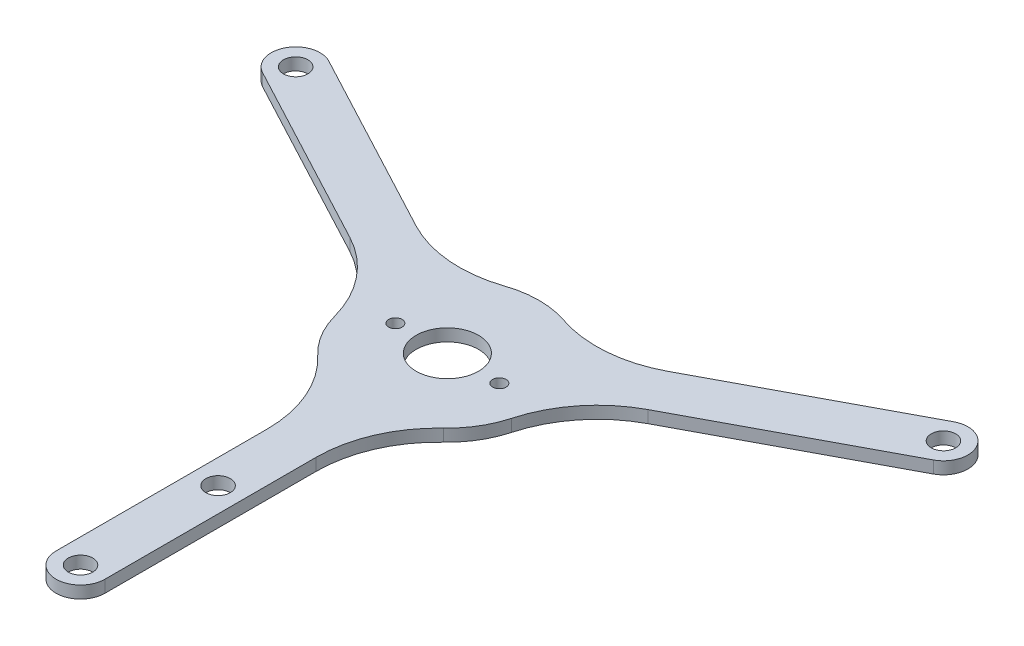
ISO-10303-21;
HEADER;
FILE_DESCRIPTION(('STEP AP214'),'2;1');
FILE_NAME('part.step','',(''),(''),'','','');
FILE_SCHEMA(('AUTOMOTIVE_DESIGN { 1 0 10303 214 1 1 1 1 }'));
ENDSEC;
DATA;
#1=APPLICATION_CONTEXT('core data for automotive mechanical design processes');
#2=APPLICATION_PROTOCOL_DEFINITION('international standard','automotive_design',2000,#1);
#3=PRODUCT_CONTEXT('',#1,'mechanical');
#4=PRODUCT('Part','Part','',(#3));
#5=PRODUCT_RELATED_PRODUCT_CATEGORY('part','',(#4));
#6=PRODUCT_DEFINITION_FORMATION('','',#4);
#7=PRODUCT_DEFINITION_CONTEXT('part definition',#1,'design');
#8=PRODUCT_DEFINITION('design','',#6,#7);
#9=PRODUCT_DEFINITION_SHAPE('','',#8);
#10=(LENGTH_UNIT() NAMED_UNIT(*) SI_UNIT(.MILLI.,.METRE.));
#11=(NAMED_UNIT(*) PLANE_ANGLE_UNIT() SI_UNIT($,.RADIAN.));
#12=(NAMED_UNIT(*) SI_UNIT($,.STERADIAN.) SOLID_ANGLE_UNIT());
#13=UNCERTAINTY_MEASURE_WITH_UNIT(LENGTH_MEASURE(1.E-05),#10,'distance_accuracy_value','');
#14=(GEOMETRIC_REPRESENTATION_CONTEXT(3) GLOBAL_UNCERTAINTY_ASSIGNED_CONTEXT((#13)) GLOBAL_UNIT_ASSIGNED_CONTEXT((#10,
#11,#12)) REPRESENTATION_CONTEXT('',''));
#15=CARTESIAN_POINT('',(0.,0.,0.));
#16=DIRECTION('',(0.,0.,1.));
#17=DIRECTION('',(1.,0.,0.));
#18=AXIS2_PLACEMENT_3D('',#15,#16,#17);
#19=CARTESIAN_POINT('',(-3.99999999999993,2.,0.));
#20=DIRECTION('',(-1.,0.,0.));
#21=DIRECTION('',(0.,0.,1.));
#22=AXIS2_PLACEMENT_3D('',#19,#20,#21);
#23=PLANE('',#22);
#24=DIRECTION('',(0.,0.,-1.));
#25=VECTOR('',#24,1.);
#26=CARTESIAN_POINT('',(-3.99999999999993,2.,0.));
#27=LINE('',#26,#25);
#28=CARTESIAN_POINT('',(-3.99999999999993,2.,60.));
#29=VERTEX_POINT('',#28);
#30=CARTESIAN_POINT('',(-3.99999999999993,2.,25.4754784057141));
#31=VERTEX_POINT('',#30);
#32=EDGE_CURVE('E173',#29,#31,#27,.T.);
#33=ORIENTED_EDGE('',*,*,#32,.T.);
#34=DIRECTION('',(0.,-1.,0.));
#35=VECTOR('',#34,1.);
#36=CARTESIAN_POINT('',(-3.99999999999993,2.,25.4754784057141));
#37=LINE('',#36,#35);
#38=CARTESIAN_POINT('',(-3.99999999999993,0.,25.4754784057141));
#39=VERTEX_POINT('',#38);
#40=EDGE_CURVE('E342',#31,#39,#37,.T.);
#41=ORIENTED_EDGE('',*,*,#40,.T.);
#42=DIRECTION('',(0.,0.,-1.));
#43=VECTOR('',#42,1.);
#44=CARTESIAN_POINT('',(-3.99999999999993,0.,0.));
#45=LINE('',#44,#43);
#46=CARTESIAN_POINT('',(-3.99999999999993,0.,60.));
#47=VERTEX_POINT('',#46);
#48=EDGE_CURVE('E176',#47,#39,#45,.T.);
#49=ORIENTED_EDGE('',*,*,#48,.F.);
#50=DIRECTION('',(0.,-1.,0.));
#51=VECTOR('',#50,1.);
#52=CARTESIAN_POINT('',(-3.99999999999993,2.,60.));
#53=LINE('',#52,#51);
#54=EDGE_CURVE('E169',#29,#47,#53,.T.);
#55=ORIENTED_EDGE('',*,*,#54,.F.);
#56=EDGE_LOOP('',(#33,#41,#49,#55));
#57=FACE_BOUND('',#56,.T.);
#58=ADVANCED_FACE('F43',(#57),#23,.T.);
#59=CARTESIAN_POINT('',(0.,2.,60.));
#60=DIRECTION('',(0.,-1.,0.));
#61=DIRECTION('',(0.,0.,-1.));
#62=AXIS2_PLACEMENT_3D('',#59,#60,#61);
#63=CYLINDRICAL_SURFACE('',#62,4.);
#64=CARTESIAN_POINT('',(0.,0.,60.));
#65=DIRECTION('',(0.,1.,0.));
#66=DIRECTION('',(0.,0.,1.));
#67=AXIS2_PLACEMENT_3D('',#64,#65,#66);
#68=CIRCLE('',#67,4.);
#69=CARTESIAN_POINT('',(4.00000000000003,0.,60.));
#70=VERTEX_POINT('',#69);
#71=EDGE_CURVE('E284',#47,#70,#68,.T.);
#72=ORIENTED_EDGE('',*,*,#71,.T.);
#73=DIRECTION('',(0.,-1.,0.));
#74=VECTOR('',#73,1.);
#75=CARTESIAN_POINT('',(4.00000000000003,2.,60.));
#76=LINE('',#75,#74);
#77=CARTESIAN_POINT('',(4.00000000000003,2.,60.));
#78=VERTEX_POINT('',#77);
#79=EDGE_CURVE('E180',#78,#70,#76,.T.);
#80=ORIENTED_EDGE('',*,*,#79,.F.);
#81=CARTESIAN_POINT('',(0.,2.,60.));
#82=DIRECTION('',(0.,1.,0.));
#83=DIRECTION('',(0.,0.,1.));
#84=AXIS2_PLACEMENT_3D('',#81,#82,#83);
#85=CIRCLE('',#84,4.);
#86=EDGE_CURVE('E183',#29,#78,#85,.T.);
#87=ORIENTED_EDGE('',*,*,#86,.F.);
#88=ORIENTED_EDGE('',*,*,#54,.T.);
#89=EDGE_LOOP('',(#72,#80,#87,#88));
#90=FACE_BOUND('',#89,.T.);
#91=ADVANCED_FACE('F184',(#90),#63,.T.);
#92=CARTESIAN_POINT('',(4.00000000000003,2.,0.));
#93=DIRECTION('',(-1.,0.,0.));
#94=DIRECTION('',(0.,0.,1.));
#95=AXIS2_PLACEMENT_3D('',#92,#93,#94);
#96=PLANE('',#95);
#97=DIRECTION('',(0.,0.,-1.));
#98=VECTOR('',#97,1.);
#99=CARTESIAN_POINT('',(4.00000000000003,0.,0.));
#100=LINE('',#99,#98);
#101=CARTESIAN_POINT('',(4.00000000000003,0.,25.475478405714));
#102=VERTEX_POINT('',#101);
#103=EDGE_CURVE('E286',#70,#102,#100,.T.);
#104=ORIENTED_EDGE('',*,*,#103,.T.);
#105=DIRECTION('',(0.,1.,0.));
#106=VECTOR('',#105,1.);
#107=CARTESIAN_POINT('',(4.00000000000003,2.,25.475478405714));
#108=LINE('',#107,#106);
#109=CARTESIAN_POINT('',(4.00000000000003,2.,25.475478405714));
#110=VERTEX_POINT('',#109);
#111=EDGE_CURVE('E340',#102,#110,#108,.T.);
#112=ORIENTED_EDGE('',*,*,#111,.T.);
#113=DIRECTION('',(0.,0.,-1.));
#114=VECTOR('',#113,1.);
#115=CARTESIAN_POINT('',(4.00000000000003,2.,0.));
#116=LINE('',#115,#114);
#117=EDGE_CURVE('E190',#78,#110,#116,.T.);
#118=ORIENTED_EDGE('',*,*,#117,.F.);
#119=ORIENTED_EDGE('',*,*,#79,.T.);
#120=EDGE_LOOP('',(#104,#112,#118,#119));
#121=FACE_BOUND('',#120,.T.);
#122=ADVANCED_FACE('F420',(#121),#96,.F.);
#123=CARTESIAN_POINT('',(0.,2.,0.));
#124=DIRECTION('',(0.,-1.,0.));
#125=DIRECTION('',(0.,0.,-1.));
#126=AXIS2_PLACEMENT_3D('',#123,#124,#125);
#127=CYLINDRICAL_SURFACE('',#126,15.);
#128=CARTESIAN_POINT('',(0.,2.,0.));
#129=DIRECTION('',(0.,1.,0.));
#130=DIRECTION('',(0.,0.,1.));
#131=AXIS2_PLACEMENT_3D('',#128,#129,#130);
#132=CIRCLE('',#131,15.);
#133=CARTESIAN_POINT('',(10.2857142857143,2.,10.9180621738774));
#134=VERTEX_POINT('',#133);
#135=CARTESIAN_POINT('',(14.4689270751926,2.,3.95602695804228));
#136=VERTEX_POINT('',#135);
#137=EDGE_CURVE('E214',#134,#136,#132,.T.);
#138=ORIENTED_EDGE('',*,*,#137,.F.);
#139=DIRECTION('',(0.,-1.,0.));
#140=VECTOR('',#139,1.);
#141=CARTESIAN_POINT('',(10.2857142857143,2.,10.9180621738774));
#142=LINE('',#141,#140);
#143=CARTESIAN_POINT('',(10.2857142857143,0.,10.9180621738774));
#144=VERTEX_POINT('',#143);
#145=EDGE_CURVE('E337',#134,#144,#142,.T.);
#146=ORIENTED_EDGE('',*,*,#145,.T.);
#147=CARTESIAN_POINT('',(0.,0.,0.));
#148=DIRECTION('',(0.,1.,0.));
#149=DIRECTION('',(0.,0.,1.));
#150=AXIS2_PLACEMENT_3D('',#147,#148,#149);
#151=CIRCLE('',#150,15.);
#152=CARTESIAN_POINT('',(14.4689270751926,0.,3.95602695804228));
#153=VERTEX_POINT('',#152);
#154=EDGE_CURVE('E289',#144,#153,#151,.T.);
#155=ORIENTED_EDGE('',*,*,#154,.T.);
#156=DIRECTION('',(0.,-1.,0.));
#157=VECTOR('',#156,1.);
#158=CARTESIAN_POINT('',(14.4689270751926,2.,3.95602695804228));
#159=LINE('',#158,#157);
#160=EDGE_CURVE('E179',#153,#136,#159,.F.);
#161=ORIENTED_EDGE('',*,*,#160,.T.);
#162=EDGE_LOOP('',(#138,#146,#155,#161));
#163=FACE_BOUND('',#162,.T.);
#164=ADVANCED_FACE('F408',(#163),#127,.T.);
#165=CARTESIAN_POINT('',(1.87788625114359,2.,3.53179037143571));
#166=DIRECTION('',(0.469471562785895,0.,0.882947592858925));
#167=DIRECTION('',(0.882947592858925,0.,-0.469471562785895));
#168=AXIS2_PLACEMENT_3D('',#165,#166,#167);
#169=PLANE('',#168);
#170=DIRECTION('',(-0.882947592858925,0.,0.469471562785895));
#171=VECTOR('',#170,1.);
#172=CARTESIAN_POINT('',(1.87788625114359,2.,3.53179037143571));
#173=LINE('',#172,#171);
#174=CARTESIAN_POINT('',(54.8547418226791,2.,-24.636503395718));
#175=VERTEX_POINT('',#174);
#176=CARTESIAN_POINT('',(24.3713985863983,2.,-8.42822228841316));
#177=VERTEX_POINT('',#176);
#178=EDGE_CURVE('E223',#175,#177,#173,.T.);
#179=ORIENTED_EDGE('',*,*,#178,.T.);
#180=DIRECTION('',(0.,-1.,0.));
#181=VECTOR('',#180,1.);
#182=CARTESIAN_POINT('',(24.3713985863983,2.,-8.42822228841316));
#183=LINE('',#182,#181);
#184=CARTESIAN_POINT('',(24.3713985863983,0.,-8.42822228841316));
#185=VERTEX_POINT('',#184);
#186=EDGE_CURVE('E359',#177,#185,#183,.T.);
#187=ORIENTED_EDGE('',*,*,#186,.T.);
#188=DIRECTION('',(-0.882947592858925,0.,0.469471562785895));
#189=VECTOR('',#188,1.);
#190=CARTESIAN_POINT('',(1.87788625114359,0.,3.53179037143571));
#191=LINE('',#190,#189);
#192=CARTESIAN_POINT('',(54.8547418226791,0.,-24.636503395718));
#193=VERTEX_POINT('',#192);
#194=EDGE_CURVE('E296',#193,#185,#191,.T.);
#195=ORIENTED_EDGE('',*,*,#194,.F.);
#196=DIRECTION('',(0.,-1.,0.));
#197=VECTOR('',#196,1.);
#198=CARTESIAN_POINT('',(54.8547418226791,2.,-24.636503395718));
#199=LINE('',#198,#197);
#200=EDGE_CURVE('E333',#175,#193,#199,.T.);
#201=ORIENTED_EDGE('',*,*,#200,.F.);
#202=EDGE_LOOP('',(#179,#187,#195,#201));
#203=FACE_BOUND('',#202,.T.);
#204=ADVANCED_FACE('F399',(#203),#169,.T.);
#205=CARTESIAN_POINT('',(52.9768555715355,2.,-28.1682937671537));
#206=DIRECTION('',(0.,-1.,0.));
#207=DIRECTION('',(0.,0.,-1.));
#208=AXIS2_PLACEMENT_3D('',#205,#206,#207);
#209=CYLINDRICAL_SURFACE('',#208,4.);
#210=CARTESIAN_POINT('',(52.9768555715355,0.,-28.1682937671537));
#211=DIRECTION('',(0.,1.,0.));
#212=DIRECTION('',(0.,0.,1.));
#213=AXIS2_PLACEMENT_3D('',#210,#211,#212);
#214=CIRCLE('',#213,4.);
#215=CARTESIAN_POINT('',(51.0989693203919,0.,-31.7000841385894));
#216=VERTEX_POINT('',#215);
#217=EDGE_CURVE('E299',#216,#193,#214,.F.);
#218=ORIENTED_EDGE('',*,*,#217,.F.);
#219=DIRECTION('',(0.,-1.,0.));
#220=VECTOR('',#219,1.);
#221=CARTESIAN_POINT('',(51.0989693203919,2.,-31.7000841385894));
#222=LINE('',#221,#220);
#223=CARTESIAN_POINT('',(51.0989693203919,2.,-31.7000841385894));
#224=VERTEX_POINT('',#223);
#225=EDGE_CURVE('E331',#224,#216,#222,.T.);
#226=ORIENTED_EDGE('',*,*,#225,.F.);
#227=CARTESIAN_POINT('',(52.9768555715355,2.,-28.1682937671537));
#228=DIRECTION('',(0.,1.,0.));
#229=DIRECTION('',(0.,0.,1.));
#230=AXIS2_PLACEMENT_3D('',#227,#228,#229);
#231=CIRCLE('',#230,4.);
#232=EDGE_CURVE('E401',#224,#175,#231,.F.);
#233=ORIENTED_EDGE('',*,*,#232,.T.);
#234=ORIENTED_EDGE('',*,*,#200,.T.);
#235=EDGE_LOOP('',(#218,#226,#233,#234));
#236=FACE_BOUND('',#235,.T.);
#237=ADVANCED_FACE('F445',(#236),#209,.T.);
#238=CARTESIAN_POINT('',(-1.87788625114358,2.,-3.53179037143569));
#239=DIRECTION('',(0.469471562785895,0.,0.882947592858924));
#240=DIRECTION('',(0.882947592858925,0.,-0.469471562785896));
#241=AXIS2_PLACEMENT_3D('',#238,#239,#240);
#242=PLANE('',#241);
#243=DIRECTION('',(-0.882947592858925,0.,0.469471562785896));
#244=VECTOR('',#243,1.);
#245=CARTESIAN_POINT('',(-1.87788625114358,0.,-3.53179037143569));
#246=LINE('',#245,#244);
#247=CARTESIAN_POINT('',(20.6156260841111,0.,-15.4918030312846));
#248=VERTEX_POINT('',#247);
#249=EDGE_CURVE('E294',#216,#248,#246,.T.);
#250=ORIENTED_EDGE('',*,*,#249,.T.);
#251=DIRECTION('',(0.,1.,0.));
#252=VECTOR('',#251,1.);
#253=CARTESIAN_POINT('',(20.6156260841111,2.,-15.4918030312846));
#254=LINE('',#253,#252);
#255=CARTESIAN_POINT('',(20.6156260841111,2.,-15.4918030312846));
#256=VERTEX_POINT('',#255);
#257=EDGE_CURVE('E357',#248,#256,#254,.T.);
#258=ORIENTED_EDGE('',*,*,#257,.T.);
#259=DIRECTION('',(-0.882947592858925,0.,0.469471562785896));
#260=VECTOR('',#259,1.);
#261=CARTESIAN_POINT('',(-1.87788625114358,2.,-3.53179037143569));
#262=LINE('',#261,#260);
#263=EDGE_CURVE('E221',#224,#256,#262,.T.);
#264=ORIENTED_EDGE('',*,*,#263,.F.);
#265=ORIENTED_EDGE('',*,*,#225,.T.);
#266=EDGE_LOOP('',(#250,#258,#264,#265));
#267=FACE_BOUND('',#266,.T.);
#268=ADVANCED_FACE('F448',(#267),#242,.F.);
#269=CARTESIAN_POINT('',(4.81122635502566,0.,-14.2074663807699));
#270=VERTEX_POINT('',#269);
#271=CARTESIAN_POINT('',(-4.81122635502567,0.,-14.2074663807699));
#272=VERTEX_POINT('',#271);
#273=EDGE_CURVE('E290',#270,#272,#151,.T.);
#274=ORIENTED_EDGE('',*,*,#273,.T.);
#275=DIRECTION('',(0.,-1.,0.));
#276=VECTOR('',#275,1.);
#277=CARTESIAN_POINT('',(-4.81122635502567,2.,-14.2074663807699));
#278=LINE('',#277,#276);
#279=CARTESIAN_POINT('',(-4.81122635502567,2.,-14.2074663807699));
#280=VERTEX_POINT('',#279);
#281=EDGE_CURVE('E355',#272,#280,#278,.F.);
#282=ORIENTED_EDGE('',*,*,#281,.T.);
#283=CARTESIAN_POINT('',(4.81122635502566,2.,-14.2074663807699));
#284=VERTEX_POINT('',#283);
#285=EDGE_CURVE('E215',#284,#280,#132,.T.);
#286=ORIENTED_EDGE('',*,*,#285,.F.);
#287=DIRECTION('',(0.,-1.,0.));
#288=VECTOR('',#287,1.);
#289=CARTESIAN_POINT('',(4.81122635502566,2.,-14.2074663807699));
#290=LINE('',#289,#288);
#291=EDGE_CURVE('E352',#284,#270,#290,.T.);
#292=ORIENTED_EDGE('',*,*,#291,.T.);
#293=EDGE_LOOP('',(#274,#282,#286,#292));
#294=FACE_BOUND('',#293,.T.);
#295=ADVANCED_FACE('F452',(#294),#127,.T.);
#296=CARTESIAN_POINT('',(1.87788625114358,2.,-3.53179037143569));
#297=DIRECTION('',(0.469471562785895,0.,-0.882947592858925));
#298=DIRECTION('',(-0.882947592858925,0.,-0.469471562785895));
#299=AXIS2_PLACEMENT_3D('',#296,#297,#298);
#300=PLANE('',#299);
#301=DIRECTION('',(0.882947592858925,0.,0.469471562785895));
#302=VECTOR('',#301,1.);
#303=CARTESIAN_POINT('',(1.87788625114358,2.,-3.53179037143569));
#304=LINE('',#303,#302);
#305=CARTESIAN_POINT('',(-51.0989693203919,2.,-31.7000841385894));
#306=VERTEX_POINT('',#305);
#307=CARTESIAN_POINT('',(-20.6156260841111,2.,-15.4918030312846));
#308=VERTEX_POINT('',#307);
#309=EDGE_CURVE('E220',#306,#308,#304,.T.);
#310=ORIENTED_EDGE('',*,*,#309,.T.);
#311=DIRECTION('',(0.,-1.,0.));
#312=VECTOR('',#311,1.);
#313=CARTESIAN_POINT('',(-20.6156260841111,2.,-15.4918030312846));
#314=LINE('',#313,#312);
#315=CARTESIAN_POINT('',(-20.6156260841111,0.,-15.4918030312846));
#316=VERTEX_POINT('',#315);
#317=EDGE_CURVE('E349',#308,#316,#314,.T.);
#318=ORIENTED_EDGE('',*,*,#317,.T.);
#319=DIRECTION('',(0.882947592858925,0.,0.469471562785895));
#320=VECTOR('',#319,1.);
#321=CARTESIAN_POINT('',(1.87788625114358,0.,-3.53179037143569));
#322=LINE('',#321,#320);
#323=CARTESIAN_POINT('',(-51.0989693203919,0.,-31.7000841385894));
#324=VERTEX_POINT('',#323);
#325=EDGE_CURVE('E293',#324,#316,#322,.T.);
#326=ORIENTED_EDGE('',*,*,#325,.F.);
#327=DIRECTION('',(0.,-1.,0.));
#328=VECTOR('',#327,1.);
#329=CARTESIAN_POINT('',(-51.0989693203919,2.,-31.7000841385894));
#330=LINE('',#329,#328);
#331=EDGE_CURVE('E329',#306,#324,#330,.T.);
#332=ORIENTED_EDGE('',*,*,#331,.F.);
#333=EDGE_LOOP('',(#310,#318,#326,#332));
#334=FACE_BOUND('',#333,.T.);
#335=ADVANCED_FACE('F454',(#334),#300,.T.);
#336=CARTESIAN_POINT('',(-52.9768555715355,2.,-28.1682937671537));
#337=DIRECTION('',(0.,-1.,0.));
#338=DIRECTION('',(0.,0.,-1.));
#339=AXIS2_PLACEMENT_3D('',#336,#337,#338);
#340=CYLINDRICAL_SURFACE('',#339,4.);
#341=CARTESIAN_POINT('',(-52.9768555715355,0.,-28.1682937671537));
#342=DIRECTION('',(0.,1.,0.));
#343=DIRECTION('',(0.,0.,1.));
#344=AXIS2_PLACEMENT_3D('',#341,#342,#343);
#345=CIRCLE('',#344,4.);
#346=CARTESIAN_POINT('',(-54.8547418226791,0.,-24.636503395718));
#347=VERTEX_POINT('',#346);
#348=EDGE_CURVE('E306',#324,#347,#345,.T.);
#349=ORIENTED_EDGE('',*,*,#348,.T.);
#350=DIRECTION('',(0.,-1.,0.));
#351=VECTOR('',#350,1.);
#352=CARTESIAN_POINT('',(-54.8547418226791,2.,-24.636503395718));
#353=LINE('',#352,#351);
#354=CARTESIAN_POINT('',(-54.8547418226791,2.,-24.636503395718));
#355=VERTEX_POINT('',#354);
#356=EDGE_CURVE('E282',#355,#347,#353,.T.);
#357=ORIENTED_EDGE('',*,*,#356,.F.);
#358=CARTESIAN_POINT('',(-52.9768555715355,2.,-28.1682937671537));
#359=DIRECTION('',(0.,1.,0.));
#360=DIRECTION('',(0.,0.,1.));
#361=AXIS2_PLACEMENT_3D('',#358,#359,#360);
#362=CIRCLE('',#361,4.);
#363=EDGE_CURVE('E240',#306,#355,#362,.T.);
#364=ORIENTED_EDGE('',*,*,#363,.F.);
#365=ORIENTED_EDGE('',*,*,#331,.T.);
#366=EDGE_LOOP('',(#349,#357,#364,#365));
#367=FACE_BOUND('',#366,.T.);
#368=ADVANCED_FACE('F457',(#367),#340,.T.);
#369=CARTESIAN_POINT('',(-1.87788625114359,2.,3.53179037143571));
#370=DIRECTION('',(0.469471562785895,0.,-0.882947592858925));
#371=DIRECTION('',(-0.882947592858925,0.,-0.469471562785895));
#372=AXIS2_PLACEMENT_3D('',#369,#370,#371);
#373=PLANE('',#372);
#374=DIRECTION('',(0.882947592858925,0.,0.469471562785895));
#375=VECTOR('',#374,1.);
#376=CARTESIAN_POINT('',(-1.87788625114359,0.,3.53179037143571));
#377=LINE('',#376,#375);
#378=CARTESIAN_POINT('',(-24.3713985863983,0.,-8.42822228841316));
#379=VERTEX_POINT('',#378);
#380=EDGE_CURVE('E308',#347,#379,#377,.T.);
#381=ORIENTED_EDGE('',*,*,#380,.T.);
#382=DIRECTION('',(0.,1.,0.));
#383=VECTOR('',#382,1.);
#384=CARTESIAN_POINT('',(-24.3713985863983,2.,-8.42822228841316));
#385=LINE('',#384,#383);
#386=CARTESIAN_POINT('',(-24.3713985863983,2.,-8.42822228841316));
#387=VERTEX_POINT('',#386);
#388=EDGE_CURVE('E59',#379,#387,#385,.T.);
#389=ORIENTED_EDGE('',*,*,#388,.T.);
#390=DIRECTION('',(0.882947592858925,0.,0.469471562785895));
#391=VECTOR('',#390,1.);
#392=CARTESIAN_POINT('',(-1.87788625114359,2.,3.53179037143571));
#393=LINE('',#392,#391);
#394=EDGE_CURVE('E245',#355,#387,#393,.T.);
#395=ORIENTED_EDGE('',*,*,#394,.F.);
#396=ORIENTED_EDGE('',*,*,#356,.T.);
#397=EDGE_LOOP('',(#381,#389,#395,#396));
#398=FACE_BOUND('',#397,.T.);
#399=ADVANCED_FACE('F461',(#398),#373,.F.);
#400=CARTESIAN_POINT('',(-52.9768555715355,2.,-28.1682937671537));
#401=DIRECTION('',(0.,-1.,0.));
#402=DIRECTION('',(0.,0.,-1.));
#403=AXIS2_PLACEMENT_3D('',#400,#401,#402);
#404=CYLINDRICAL_SURFACE('',#403,2.00000000000323);
#405=CARTESIAN_POINT('',(-52.9768555715355,2.,-28.1682937671537));
#406=DIRECTION('',(0.,1.,0.));
#407=DIRECTION('',(0.,0.,1.));
#408=AXIS2_PLACEMENT_3D('',#405,#406,#407);
#409=CIRCLE('',#408,2.00000000000323);
#410=CARTESIAN_POINT('',(-52.9768555715355,2.,-26.1682937671505));
#411=VERTEX_POINT('',#410);
#412=EDGE_CURVE('E273',#411,#411,#409,.T.);
#413=ORIENTED_EDGE('',*,*,#412,.T.);
#414=EDGE_LOOP('',(#413));
#415=FACE_BOUND('',#414,.T.);
#416=CARTESIAN_POINT('',(-52.9768555715355,0.,-28.1682937671537));
#417=DIRECTION('',(0.,1.,0.));
#418=DIRECTION('',(0.,0.,1.));
#419=AXIS2_PLACEMENT_3D('',#416,#417,#418);
#420=CIRCLE('',#419,2.00000000000323);
#421=CARTESIAN_POINT('',(-52.9768555715355,0.,-26.1682937671505));
#422=VERTEX_POINT('',#421);
#423=EDGE_CURVE('E201',#422,#422,#420,.T.);
#424=ORIENTED_EDGE('',*,*,#423,.F.);
#425=EDGE_LOOP('',(#424));
#426=FACE_BOUND('',#425,.T.);
#427=ADVANCED_FACE('F465',(#415,#426),#404,.F.);
#428=CARTESIAN_POINT('',(-8.5,2.,0.));
#429=DIRECTION('',(0.,-1.,0.));
#430=DIRECTION('',(0.,0.,-1.));
#431=AXIS2_PLACEMENT_3D('',#428,#429,#430);
#432=CYLINDRICAL_SURFACE('',#431,1.1);
#433=CARTESIAN_POINT('',(-8.5,2.,0.));
#434=DIRECTION('',(0.,1.,0.));
#435=DIRECTION('',(0.,0.,1.));
#436=AXIS2_PLACEMENT_3D('',#433,#434,#435);
#437=CIRCLE('',#436,1.1);
#438=CARTESIAN_POINT('',(-8.5,2.,1.1));
#439=VERTEX_POINT('',#438);
#440=EDGE_CURVE('E270',#439,#439,#437,.F.);
#441=ORIENTED_EDGE('',*,*,#440,.F.);
#442=EDGE_LOOP('',(#441));
#443=FACE_BOUND('',#442,.T.);
#444=CARTESIAN_POINT('',(-8.5,0.,0.));
#445=DIRECTION('',(0.,1.,0.));
#446=DIRECTION('',(0.,0.,1.));
#447=AXIS2_PLACEMENT_3D('',#444,#445,#446);
#448=CIRCLE('',#447,1.1);
#449=CARTESIAN_POINT('',(-8.5,0.,1.1));
#450=VERTEX_POINT('',#449);
#451=EDGE_CURVE('E322',#450,#450,#448,.F.);
#452=ORIENTED_EDGE('',*,*,#451,.T.);
#453=EDGE_LOOP('',(#452));
#454=FACE_BOUND('',#453,.T.);
#455=ADVANCED_FACE('F484',(#443,#454),#432,.F.);
#456=CARTESIAN_POINT('',(8.5,2.,0.));
#457=DIRECTION('',(0.,-1.,0.));
#458=DIRECTION('',(0.,0.,-1.));
#459=AXIS2_PLACEMENT_3D('',#456,#457,#458);
#460=CYLINDRICAL_SURFACE('',#459,1.1);
#461=CARTESIAN_POINT('',(8.5,2.,0.));
#462=DIRECTION('',(0.,1.,0.));
#463=DIRECTION('',(0.,0.,1.));
#464=AXIS2_PLACEMENT_3D('',#461,#462,#463);
#465=CIRCLE('',#464,1.1);
#466=CARTESIAN_POINT('',(8.5,2.,1.1));
#467=VERTEX_POINT('',#466);
#468=EDGE_CURVE('E265',#467,#467,#465,.T.);
#469=ORIENTED_EDGE('',*,*,#468,.T.);
#470=EDGE_LOOP('',(#469));
#471=FACE_BOUND('',#470,.T.);
#472=CARTESIAN_POINT('',(8.5,0.,0.));
#473=DIRECTION('',(0.,1.,0.));
#474=DIRECTION('',(0.,0.,1.));
#475=AXIS2_PLACEMENT_3D('',#472,#473,#474);
#476=CIRCLE('',#475,1.1);
#477=CARTESIAN_POINT('',(8.5,0.,1.1));
#478=VERTEX_POINT('',#477);
#479=EDGE_CURVE('E319',#478,#478,#476,.T.);
#480=ORIENTED_EDGE('',*,*,#479,.F.);
#481=EDGE_LOOP('',(#480));
#482=FACE_BOUND('',#481,.T.);
#483=ADVANCED_FACE('F480',(#471,#482),#460,.F.);
#484=CARTESIAN_POINT('',(0.,2.,60.));
#485=DIRECTION('',(0.,-1.,0.));
#486=DIRECTION('',(0.,0.,-1.));
#487=AXIS2_PLACEMENT_3D('',#484,#485,#486);
#488=CYLINDRICAL_SURFACE('',#487,2.00000000000324);
#489=CARTESIAN_POINT('',(0.,2.,60.));
#490=DIRECTION('',(0.,1.,0.));
#491=DIRECTION('',(0.,0.,1.));
#492=AXIS2_PLACEMENT_3D('',#489,#490,#491);
#493=CIRCLE('',#492,2.00000000000324);
#494=CARTESIAN_POINT('',(0.,2.,62.0000000000032));
#495=VERTEX_POINT('',#494);
#496=EDGE_CURVE('E260',#495,#495,#493,.T.);
#497=ORIENTED_EDGE('',*,*,#496,.T.);
#498=EDGE_LOOP('',(#497));
#499=FACE_BOUND('',#498,.T.);
#500=CARTESIAN_POINT('',(0.,0.,60.));
#501=DIRECTION('',(0.,1.,0.));
#502=DIRECTION('',(0.,0.,1.));
#503=AXIS2_PLACEMENT_3D('',#500,#501,#502);
#504=CIRCLE('',#503,2.00000000000324);
#505=CARTESIAN_POINT('',(0.,0.,62.0000000000032));
#506=VERTEX_POINT('',#505);
#507=EDGE_CURVE('E316',#506,#506,#504,.T.);
#508=ORIENTED_EDGE('',*,*,#507,.F.);
#509=EDGE_LOOP('',(#508));
#510=FACE_BOUND('',#509,.T.);
#511=ADVANCED_FACE('F476',(#499,#510),#488,.F.);
#512=CARTESIAN_POINT('',(0.,2.,0.));
#513=DIRECTION('',(0.,-1.,0.));
#514=DIRECTION('',(0.,0.,-1.));
#515=AXIS2_PLACEMENT_3D('',#512,#513,#514);
#516=CYLINDRICAL_SURFACE('',#515,5.1);
#517=CARTESIAN_POINT('',(0.,2.,0.));
#518=DIRECTION('',(0.,1.,0.));
#519=DIRECTION('',(0.,0.,1.));
#520=AXIS2_PLACEMENT_3D('',#517,#518,#519);
#521=CIRCLE('',#520,5.1);
#522=CARTESIAN_POINT('',(0.,2.,5.1));
#523=VERTEX_POINT('',#522);
#524=EDGE_CURVE('E256',#523,#523,#521,.T.);
#525=ORIENTED_EDGE('',*,*,#524,.T.);
#526=EDGE_LOOP('',(#525));
#527=FACE_BOUND('',#526,.T.);
#528=CARTESIAN_POINT('',(0.,0.,0.));
#529=DIRECTION('',(0.,1.,0.));
#530=DIRECTION('',(0.,0.,1.));
#531=AXIS2_PLACEMENT_3D('',#528,#529,#530);
#532=CIRCLE('',#531,5.1);
#533=CARTESIAN_POINT('',(0.,0.,5.1));
#534=VERTEX_POINT('',#533);
#535=EDGE_CURVE('E313',#534,#534,#532,.T.);
#536=ORIENTED_EDGE('',*,*,#535,.F.);
#537=EDGE_LOOP('',(#536));
#538=FACE_BOUND('',#537,.T.);
#539=ADVANCED_FACE('F472',(#527,#538),#516,.F.);
#540=CARTESIAN_POINT('',(0.,2.,37.5));
#541=DIRECTION('',(0.,-1.,0.));
#542=DIRECTION('',(0.,0.,-1.));
#543=AXIS2_PLACEMENT_3D('',#540,#541,#542);
#544=CYLINDRICAL_SURFACE('',#543,2.);
#545=CARTESIAN_POINT('',(0.,2.,37.5));
#546=DIRECTION('',(0.,1.,0.));
#547=DIRECTION('',(0.,0.,1.));
#548=AXIS2_PLACEMENT_3D('',#545,#546,#547);
#549=CIRCLE('',#548,2.);
#550=CARTESIAN_POINT('',(0.,2.,39.5));
#551=VERTEX_POINT('',#550);
#552=EDGE_CURVE('E249',#551,#551,#549,.T.);
#553=ORIENTED_EDGE('',*,*,#552,.T.);
#554=EDGE_LOOP('',(#553));
#555=FACE_BOUND('',#554,.T.);
#556=CARTESIAN_POINT('',(0.,0.,37.5));
#557=DIRECTION('',(0.,1.,0.));
#558=DIRECTION('',(0.,0.,1.));
#559=AXIS2_PLACEMENT_3D('',#556,#557,#558);
#560=CIRCLE('',#559,2.);
#561=CARTESIAN_POINT('',(0.,0.,39.5));
#562=VERTEX_POINT('',#561);
#563=EDGE_CURVE('E310',#562,#562,#560,.T.);
#564=ORIENTED_EDGE('',*,*,#563,.F.);
#565=EDGE_LOOP('',(#564));
#566=FACE_BOUND('',#565,.T.);
#567=ADVANCED_FACE('F469',(#555,#566),#544,.F.);
#568=CARTESIAN_POINT('',(-14.4689270751926,0.,3.95602695804229));
#569=VERTEX_POINT('',#568);
#570=CARTESIAN_POINT('',(-10.2857142857143,0.,10.9180621738775));
#571=VERTEX_POINT('',#570);
#572=EDGE_CURVE('E295',#569,#571,#151,.T.);
#573=ORIENTED_EDGE('',*,*,#572,.T.);
#574=DIRECTION('',(0.,-1.,0.));
#575=VECTOR('',#574,1.);
#576=CARTESIAN_POINT('',(-10.2857142857143,2.,10.9180621738775));
#577=LINE('',#576,#575);
#578=CARTESIAN_POINT('',(-10.2857142857143,2.,10.9180621738775));
#579=VERTEX_POINT('',#578);
#580=EDGE_CURVE('E347',#571,#579,#577,.F.);
#581=ORIENTED_EDGE('',*,*,#580,.T.);
#582=CARTESIAN_POINT('',(-14.4689270751926,2.,3.95602695804229));
#583=VERTEX_POINT('',#582);
#584=EDGE_CURVE('E222',#583,#579,#132,.T.);
#585=ORIENTED_EDGE('',*,*,#584,.F.);
#586=DIRECTION('',(0.,-1.,0.));
#587=VECTOR('',#586,1.);
#588=CARTESIAN_POINT('',(-14.4689270751926,2.,3.95602695804229));
#589=LINE('',#588,#587);
#590=EDGE_CURVE('E344',#583,#569,#589,.T.);
#591=ORIENTED_EDGE('',*,*,#590,.T.);
#592=EDGE_LOOP('',(#573,#581,#585,#591));
#593=FACE_BOUND('',#592,.T.);
#594=ADVANCED_FACE('F413',(#593),#127,.T.);
#595=CARTESIAN_POINT('',(52.9768555715355,2.,-28.1682937671537));
#596=DIRECTION('',(0.,-1.,0.));
#597=DIRECTION('',(0.,0.,-1.));
#598=AXIS2_PLACEMENT_3D('',#595,#596,#597);
#599=CYLINDRICAL_SURFACE('',#598,2.00000000000322);
#600=CARTESIAN_POINT('',(52.9768555715355,2.,-28.1682937671537));
#601=DIRECTION('',(0.,1.,0.));
#602=DIRECTION('',(0.,0.,1.));
#603=AXIS2_PLACEMENT_3D('',#600,#601,#602);
#604=CIRCLE('',#603,2.00000000000322);
#605=CARTESIAN_POINT('',(52.9768555715355,2.,-26.1682937671505));
#606=VERTEX_POINT('',#605);
#607=EDGE_CURVE('E278',#606,#606,#604,.F.);
#608=ORIENTED_EDGE('',*,*,#607,.F.);
#609=EDGE_LOOP('',(#608));
#610=FACE_BOUND('',#609,.T.);
#611=CARTESIAN_POINT('',(52.9768555715355,0.,-28.1682937671537));
#612=DIRECTION('',(0.,1.,0.));
#613=DIRECTION('',(0.,0.,1.));
#614=AXIS2_PLACEMENT_3D('',#611,#612,#613);
#615=CIRCLE('',#614,2.00000000000322);
#616=CARTESIAN_POINT('',(52.9768555715355,0.,-26.1682937671505));
#617=VERTEX_POINT('',#616);
#618=EDGE_CURVE('E198',#617,#617,#615,.F.);
#619=ORIENTED_EDGE('',*,*,#618,.T.);
#620=EDGE_LOOP('',(#619));
#621=FACE_BOUND('',#620,.T.);
#622=ADVANCED_FACE('F468',(#610,#621),#599,.F.);
#623=CARTESIAN_POINT('',(0.,2.,0.));
#624=DIRECTION('',(0.,1.,0.));
#625=DIRECTION('',(0.,0.,1.));
#626=AXIS2_PLACEMENT_3D('',#623,#624,#625);
#627=PLANE('',#626);
#628=ORIENTED_EDGE('',*,*,#32,.F.);
#629=ORIENTED_EDGE('',*,*,#86,.T.);
#630=ORIENTED_EDGE('',*,*,#117,.T.);
#631=CARTESIAN_POINT('',(24.,2.,25.475478405714));
#632=DIRECTION('',(0.,1.,0.));
#633=DIRECTION('',(0.,0.,1.));
#634=AXIS2_PLACEMENT_3D('',#631,#632,#633);
#635=CIRCLE('',#634,20.);
#636=EDGE_CURVE('E365',#110,#134,#635,.F.);
#637=ORIENTED_EDGE('',*,*,#636,.T.);
#638=ORIENTED_EDGE('',*,*,#137,.T.);
#639=CARTESIAN_POINT('',(33.7608298421162,2.,9.23072956876533));
#640=DIRECTION('',(0.,1.,0.));
#641=DIRECTION('',(0.,0.,1.));
#642=AXIS2_PLACEMENT_3D('',#639,#640,#641);
#643=CIRCLE('',#642,20.);
#644=EDGE_CURVE('E384',#136,#177,#643,.F.);
#645=ORIENTED_EDGE('',*,*,#644,.T.);
#646=ORIENTED_EDGE('',*,*,#178,.F.);
#647=ORIENTED_EDGE('',*,*,#232,.F.);
#648=ORIENTED_EDGE('',*,*,#263,.T.);
#649=CARTESIAN_POINT('',(11.2261948283932,2.,-33.1507548884631));
#650=DIRECTION('',(0.,1.,0.));
#651=DIRECTION('',(0.,0.,1.));
#652=AXIS2_PLACEMENT_3D('',#649,#650,#651);
#653=CIRCLE('',#652,20.);
#654=EDGE_CURVE('E379',#256,#284,#653,.F.);
#655=ORIENTED_EDGE('',*,*,#654,.T.);
#656=ORIENTED_EDGE('',*,*,#285,.T.);
#657=CARTESIAN_POINT('',(-11.2261948283932,2.,-33.1507548884631));
#658=DIRECTION('',(0.,1.,0.));
#659=DIRECTION('',(0.,0.,1.));
#660=AXIS2_PLACEMENT_3D('',#657,#658,#659);
#661=CIRCLE('',#660,20.);
#662=EDGE_CURVE('E374',#280,#308,#661,.F.);
#663=ORIENTED_EDGE('',*,*,#662,.T.);
#664=ORIENTED_EDGE('',*,*,#309,.F.);
#665=ORIENTED_EDGE('',*,*,#363,.T.);
#666=ORIENTED_EDGE('',*,*,#394,.T.);
#667=CARTESIAN_POINT('',(-33.7608298421162,2.,9.23072956876535));
#668=DIRECTION('',(0.,1.,0.));
#669=DIRECTION('',(0.,0.,1.));
#670=AXIS2_PLACEMENT_3D('',#667,#668,#669);
#671=CIRCLE('',#670,20.);
#672=EDGE_CURVE('E12',#387,#583,#671,.F.);
#673=ORIENTED_EDGE('',*,*,#672,.T.);
#674=ORIENTED_EDGE('',*,*,#584,.T.);
#675=CARTESIAN_POINT('',(-23.9999999999999,2.,25.4754784057141));
#676=DIRECTION('',(0.,1.,0.));
#677=DIRECTION('',(0.,0.,1.));
#678=AXIS2_PLACEMENT_3D('',#675,#676,#677);
#679=CIRCLE('',#678,20.);
#680=EDGE_CURVE('E196',#579,#31,#679,.F.);
#681=ORIENTED_EDGE('',*,*,#680,.T.);
#682=EDGE_LOOP('',(#628,#629,#630,#637,#638,#645,#646,#647,#648,#655,#656,#663,#664,#665,#666,
#673,#674,#681));
#683=FACE_BOUND('',#682,.T.);
#684=ORIENTED_EDGE('',*,*,#552,.F.);
#685=EDGE_LOOP('',(#684));
#686=FACE_BOUND('',#685,.T.);
#687=ORIENTED_EDGE('',*,*,#524,.F.);
#688=EDGE_LOOP('',(#687));
#689=FACE_BOUND('',#688,.T.);
#690=ORIENTED_EDGE('',*,*,#496,.F.);
#691=EDGE_LOOP('',(#690));
#692=FACE_BOUND('',#691,.T.);
#693=ORIENTED_EDGE('',*,*,#468,.F.);
#694=EDGE_LOOP('',(#693));
#695=FACE_BOUND('',#694,.T.);
#696=ORIENTED_EDGE('',*,*,#440,.T.);
#697=EDGE_LOOP('',(#696));
#698=FACE_BOUND('',#697,.T.);
#699=ORIENTED_EDGE('',*,*,#412,.F.);
#700=EDGE_LOOP('',(#699));
#701=FACE_BOUND('',#700,.T.);
#702=ORIENTED_EDGE('',*,*,#607,.T.);
#703=EDGE_LOOP('',(#702));
#704=FACE_BOUND('',#703,.T.);
#705=ADVANCED_FACE('F192',(#683,#686,#689,#692,#695,#698,#701,#704),#627,.T.);
#706=CARTESIAN_POINT('',(0.,0.,0.));
#707=DIRECTION('',(0.,1.,0.));
#708=DIRECTION('',(0.,0.,1.));
#709=AXIS2_PLACEMENT_3D('',#706,#707,#708);
#710=PLANE('',#709);
#711=ORIENTED_EDGE('',*,*,#48,.T.);
#712=CARTESIAN_POINT('',(-23.9999999999999,0.,25.4754784057141));
#713=DIRECTION('',(0.,1.,0.));
#714=DIRECTION('',(0.,0.,1.));
#715=AXIS2_PLACEMENT_3D('',#712,#713,#714);
#716=CIRCLE('',#715,20.);
#717=EDGE_CURVE('E368',#39,#571,#716,.T.);
#718=ORIENTED_EDGE('',*,*,#717,.T.);
#719=ORIENTED_EDGE('',*,*,#572,.F.);
#720=CARTESIAN_POINT('',(-33.7608298421162,0.,9.23072956876535));
#721=DIRECTION('',(0.,1.,0.));
#722=DIRECTION('',(0.,0.,1.));
#723=AXIS2_PLACEMENT_3D('',#720,#721,#722);
#724=CIRCLE('',#723,20.);
#725=EDGE_CURVE('E52',#569,#379,#724,.T.);
#726=ORIENTED_EDGE('',*,*,#725,.T.);
#727=ORIENTED_EDGE('',*,*,#380,.F.);
#728=ORIENTED_EDGE('',*,*,#348,.F.);
#729=ORIENTED_EDGE('',*,*,#325,.T.);
#730=CARTESIAN_POINT('',(-11.2261948283932,0.,-33.1507548884631));
#731=DIRECTION('',(0.,1.,0.));
#732=DIRECTION('',(0.,0.,1.));
#733=AXIS2_PLACEMENT_3D('',#730,#731,#732);
#734=CIRCLE('',#733,20.);
#735=EDGE_CURVE('E372',#316,#272,#734,.T.);
#736=ORIENTED_EDGE('',*,*,#735,.T.);
#737=ORIENTED_EDGE('',*,*,#273,.F.);
#738=CARTESIAN_POINT('',(11.2261948283932,0.,-33.1507548884631));
#739=DIRECTION('',(0.,1.,0.));
#740=DIRECTION('',(0.,0.,1.));
#741=AXIS2_PLACEMENT_3D('',#738,#739,#740);
#742=CIRCLE('',#741,20.);
#743=EDGE_CURVE('E377',#270,#248,#742,.T.);
#744=ORIENTED_EDGE('',*,*,#743,.T.);
#745=ORIENTED_EDGE('',*,*,#249,.F.);
#746=ORIENTED_EDGE('',*,*,#217,.T.);
#747=ORIENTED_EDGE('',*,*,#194,.T.);
#748=CARTESIAN_POINT('',(33.7608298421162,0.,9.23072956876533));
#749=DIRECTION('',(0.,1.,0.));
#750=DIRECTION('',(0.,0.,1.));
#751=AXIS2_PLACEMENT_3D('',#748,#749,#750);
#752=CIRCLE('',#751,20.);
#753=EDGE_CURVE('E382',#185,#153,#752,.T.);
#754=ORIENTED_EDGE('',*,*,#753,.T.);
#755=ORIENTED_EDGE('',*,*,#154,.F.);
#756=CARTESIAN_POINT('',(24.,0.,25.475478405714));
#757=DIRECTION('',(0.,1.,0.));
#758=DIRECTION('',(0.,0.,1.));
#759=AXIS2_PLACEMENT_3D('',#756,#757,#758);
#760=CIRCLE('',#759,20.);
#761=EDGE_CURVE('E363',#144,#102,#760,.T.);
#762=ORIENTED_EDGE('',*,*,#761,.T.);
#763=ORIENTED_EDGE('',*,*,#103,.F.);
#764=ORIENTED_EDGE('',*,*,#71,.F.);
#765=EDGE_LOOP('',(#711,#718,#719,#726,#727,#728,#729,#736,#737,#744,#745,#746,#747,#754,#755,
#762,#763,#764));
#766=FACE_BOUND('',#765,.T.);
#767=ORIENTED_EDGE('',*,*,#563,.T.);
#768=EDGE_LOOP('',(#767));
#769=FACE_BOUND('',#768,.T.);
#770=ORIENTED_EDGE('',*,*,#535,.T.);
#771=EDGE_LOOP('',(#770));
#772=FACE_BOUND('',#771,.T.);
#773=ORIENTED_EDGE('',*,*,#507,.T.);
#774=EDGE_LOOP('',(#773));
#775=FACE_BOUND('',#774,.T.);
#776=ORIENTED_EDGE('',*,*,#479,.T.);
#777=EDGE_LOOP('',(#776));
#778=FACE_BOUND('',#777,.T.);
#779=ORIENTED_EDGE('',*,*,#451,.F.);
#780=EDGE_LOOP('',(#779));
#781=FACE_BOUND('',#780,.T.);
#782=ORIENTED_EDGE('',*,*,#423,.T.);
#783=EDGE_LOOP('',(#782));
#784=FACE_BOUND('',#783,.T.);
#785=ORIENTED_EDGE('',*,*,#618,.F.);
#786=EDGE_LOOP('',(#785));
#787=FACE_BOUND('',#786,.T.);
#788=ADVANCED_FACE('F405',(#766,#769,#772,#775,#778,#781,#784,#787),#710,.F.);
#789=CARTESIAN_POINT('',(24.,2.,25.475478405714));
#790=DIRECTION('',(0.,-1.,0.));
#791=DIRECTION('',(0.,0.,-1.));
#792=AXIS2_PLACEMENT_3D('',#789,#790,#791);
#793=CYLINDRICAL_SURFACE('',#792,20.);
#794=ORIENTED_EDGE('',*,*,#636,.F.);
#795=ORIENTED_EDGE('',*,*,#111,.F.);
#796=ORIENTED_EDGE('',*,*,#761,.F.);
#797=ORIENTED_EDGE('',*,*,#145,.F.);
#798=EDGE_LOOP('',(#794,#795,#796,#797));
#799=FACE_BOUND('',#798,.T.);
#800=ADVANCED_FACE('F424',(#799),#793,.F.);
#801=CARTESIAN_POINT('',(-23.9999999999999,2.,25.4754784057141));
#802=DIRECTION('',(0.,-1.,0.));
#803=DIRECTION('',(0.,0.,-1.));
#804=AXIS2_PLACEMENT_3D('',#801,#802,#803);
#805=CYLINDRICAL_SURFACE('',#804,20.);
#806=ORIENTED_EDGE('',*,*,#680,.F.);
#807=ORIENTED_EDGE('',*,*,#580,.F.);
#808=ORIENTED_EDGE('',*,*,#717,.F.);
#809=ORIENTED_EDGE('',*,*,#40,.F.);
#810=EDGE_LOOP('',(#806,#807,#808,#809));
#811=FACE_BOUND('',#810,.T.);
#812=ADVANCED_FACE('F417',(#811),#805,.F.);
#813=CARTESIAN_POINT('',(-11.2261948283932,2.,-33.1507548884631));
#814=DIRECTION('',(0.,-1.,0.));
#815=DIRECTION('',(0.,0.,-1.));
#816=AXIS2_PLACEMENT_3D('',#813,#814,#815);
#817=CYLINDRICAL_SURFACE('',#816,20.);
#818=ORIENTED_EDGE('',*,*,#662,.F.);
#819=ORIENTED_EDGE('',*,*,#281,.F.);
#820=ORIENTED_EDGE('',*,*,#735,.F.);
#821=ORIENTED_EDGE('',*,*,#317,.F.);
#822=EDGE_LOOP('',(#818,#819,#820,#821));
#823=FACE_BOUND('',#822,.T.);
#824=ADVANCED_FACE('F431',(#823),#817,.F.);
#825=CARTESIAN_POINT('',(11.2261948283932,2.,-33.1507548884631));
#826=DIRECTION('',(0.,-1.,0.));
#827=DIRECTION('',(0.,0.,-1.));
#828=AXIS2_PLACEMENT_3D('',#825,#826,#827);
#829=CYLINDRICAL_SURFACE('',#828,20.);
#830=ORIENTED_EDGE('',*,*,#654,.F.);
#831=ORIENTED_EDGE('',*,*,#257,.F.);
#832=ORIENTED_EDGE('',*,*,#743,.F.);
#833=ORIENTED_EDGE('',*,*,#291,.F.);
#834=EDGE_LOOP('',(#830,#831,#832,#833));
#835=FACE_BOUND('',#834,.T.);
#836=ADVANCED_FACE('F527',(#835),#829,.F.);
#837=CARTESIAN_POINT('',(33.7608298421162,2.,9.23072956876533));
#838=DIRECTION('',(0.,-1.,0.));
#839=DIRECTION('',(0.,0.,-1.));
#840=AXIS2_PLACEMENT_3D('',#837,#838,#839);
#841=CYLINDRICAL_SURFACE('',#840,20.);
#842=ORIENTED_EDGE('',*,*,#644,.F.);
#843=ORIENTED_EDGE('',*,*,#160,.F.);
#844=ORIENTED_EDGE('',*,*,#753,.F.);
#845=ORIENTED_EDGE('',*,*,#186,.F.);
#846=EDGE_LOOP('',(#842,#843,#844,#845));
#847=FACE_BOUND('',#846,.T.);
#848=ADVANCED_FACE('F402',(#847),#841,.F.);
#849=CARTESIAN_POINT('',(-33.7608298421162,2.,9.23072956876535));
#850=DIRECTION('',(0.,-1.,0.));
#851=DIRECTION('',(0.,0.,-1.));
#852=AXIS2_PLACEMENT_3D('',#849,#850,#851);
#853=CYLINDRICAL_SURFACE('',#852,20.);
#854=ORIENTED_EDGE('',*,*,#672,.F.);
#855=ORIENTED_EDGE('',*,*,#388,.F.);
#856=ORIENTED_EDGE('',*,*,#725,.F.);
#857=ORIENTED_EDGE('',*,*,#590,.F.);
#858=EDGE_LOOP('',(#854,#855,#856,#857));
#859=FACE_BOUND('',#858,.T.);
#860=ADVANCED_FACE('F45',(#859),#853,.F.);
#861=CLOSED_SHELL('',(#58,#91,#122,#164,#204,#237,#268,#295,#335,#368,#399,#427,#455,#483,#511,
#539,#567,#594,#622,#705,#788,#800,#812,#824,#836,#848,#860));
#862=MANIFOLD_SOLID_BREP('B2',#861);
#863=ADVANCED_BREP_SHAPE_REPRESENTATION('',(#18,#862),#14);
#864=SHAPE_DEFINITION_REPRESENTATION(#9,#863);
ENDSEC;
END-ISO-10303-21;
